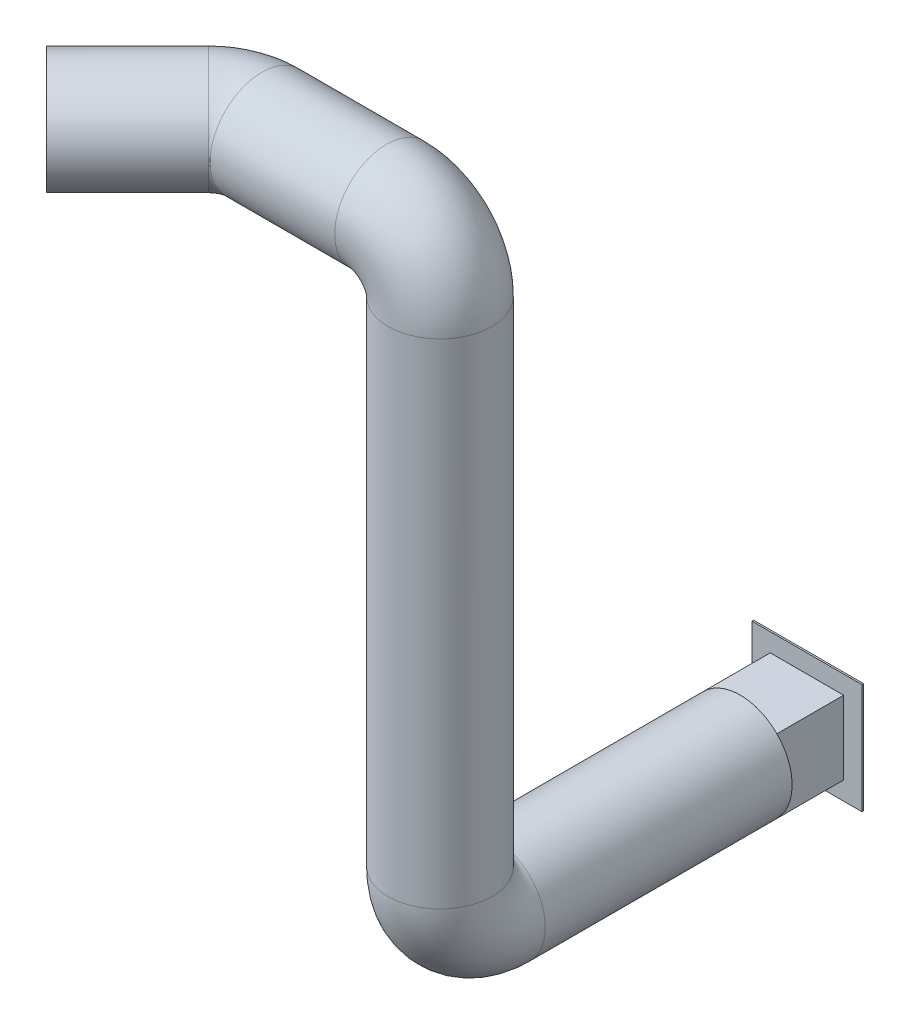
ISO-10303-21;
HEADER;
FILE_DESCRIPTION(('STEP AP214'),'2;1');
FILE_NAME('part.step','',(''),(''),'','','');
FILE_SCHEMA(('AUTOMOTIVE_DESIGN { 1 0 10303 214 1 1 1 1 }'));
ENDSEC;
DATA;
#1=APPLICATION_CONTEXT('core data for automotive mechanical design processes');
#2=APPLICATION_PROTOCOL_DEFINITION('international standard','automotive_design',2000,#1);
#3=PRODUCT_CONTEXT('',#1,'mechanical');
#4=PRODUCT('Part','Part','',(#3));
#5=PRODUCT_RELATED_PRODUCT_CATEGORY('part','',(#4));
#6=PRODUCT_DEFINITION_FORMATION('','',#4);
#7=PRODUCT_DEFINITION_CONTEXT('part definition',#1,'design');
#8=PRODUCT_DEFINITION('design','',#6,#7);
#9=PRODUCT_DEFINITION_SHAPE('','',#8);
#10=(LENGTH_UNIT() NAMED_UNIT(*) SI_UNIT(.MILLI.,.METRE.));
#11=(NAMED_UNIT(*) PLANE_ANGLE_UNIT() SI_UNIT($,.RADIAN.));
#12=(NAMED_UNIT(*) SI_UNIT($,.STERADIAN.) SOLID_ANGLE_UNIT());
#13=UNCERTAINTY_MEASURE_WITH_UNIT(LENGTH_MEASURE(1.E-05),#10,'distance_accuracy_value','');
#14=(GEOMETRIC_REPRESENTATION_CONTEXT(3) GLOBAL_UNCERTAINTY_ASSIGNED_CONTEXT((#13)) GLOBAL_UNIT_ASSIGNED_CONTEXT((#10,
#11,#12)) REPRESENTATION_CONTEXT('',''));
#15=CARTESIAN_POINT('',(0.,0.,0.));
#16=DIRECTION('',(0.,0.,1.));
#17=DIRECTION('',(1.,0.,0.));
#18=AXIS2_PLACEMENT_3D('',#15,#16,#17);
#19=CARTESIAN_POINT('',(0.,0.,2.5));
#20=DIRECTION('',(0.,0.,1.));
#21=DIRECTION('',(1.,0.,0.));
#22=AXIS2_PLACEMENT_3D('',#19,#20,#21);
#23=PLANE('',#22);
#24=DIRECTION('',(0.,-1.,0.));
#25=VECTOR('',#24,1.);
#26=CARTESIAN_POINT('',(0.,0.,2.5));
#27=LINE('',#26,#25);
#28=CARTESIAN_POINT('',(0.,0.,2.5));
#29=VERTEX_POINT('',#28);
#30=CARTESIAN_POINT('',(0.,-165.,2.5));
#31=VERTEX_POINT('',#30);
#32=EDGE_CURVE('E204',#29,#31,#27,.T.);
#33=ORIENTED_EDGE('',*,*,#32,.T.);
#34=DIRECTION('',(1.,0.,0.));
#35=VECTOR('',#34,1.);
#36=CARTESIAN_POINT('',(0.,-165.,2.5));
#37=LINE('',#36,#35);
#38=CARTESIAN_POINT('',(165.,-165.,2.5));
#39=VERTEX_POINT('',#38);
#40=EDGE_CURVE('E207',#31,#39,#37,.T.);
#41=ORIENTED_EDGE('',*,*,#40,.T.);
#42=DIRECTION('',(0.,1.,0.));
#43=VECTOR('',#42,1.);
#44=CARTESIAN_POINT('',(165.,0.,2.5));
#45=LINE('',#44,#43);
#46=CARTESIAN_POINT('',(165.,0.,2.5));
#47=VERTEX_POINT('',#46);
#48=EDGE_CURVE('E210',#39,#47,#45,.T.);
#49=ORIENTED_EDGE('',*,*,#48,.T.);
#50=DIRECTION('',(-1.,0.,0.));
#51=VECTOR('',#50,1.);
#52=CARTESIAN_POINT('',(0.,0.,2.5));
#53=LINE('',#52,#51);
#54=EDGE_CURVE('E212',#47,#29,#53,.T.);
#55=ORIENTED_EDGE('',*,*,#54,.T.);
#56=EDGE_LOOP('',(#33,#41,#49,#55));
#57=FACE_BOUND('',#56,.T.);
#58=DIRECTION('',(0.,-1.,0.));
#59=VECTOR('',#58,1.);
#60=CARTESIAN_POINT('',(27.5,-27.5,2.5));
#61=LINE('',#60,#59);
#62=CARTESIAN_POINT('',(27.5,-27.5,2.5));
#63=VERTEX_POINT('',#62);
#64=CARTESIAN_POINT('',(27.5,-137.5,2.5));
#65=VERTEX_POINT('',#64);
#66=EDGE_CURVE('E172',#63,#65,#61,.T.);
#67=ORIENTED_EDGE('',*,*,#66,.F.);
#68=DIRECTION('',(-1.,0.,0.));
#69=VECTOR('',#68,1.);
#70=CARTESIAN_POINT('',(27.5,-27.5,2.5));
#71=LINE('',#70,#69);
#72=CARTESIAN_POINT('',(137.5,-27.5,2.5));
#73=VERTEX_POINT('',#72);
#74=EDGE_CURVE('E155',#73,#63,#71,.T.);
#75=ORIENTED_EDGE('',*,*,#74,.F.);
#76=DIRECTION('',(0.,1.,0.));
#77=VECTOR('',#76,1.);
#78=CARTESIAN_POINT('',(137.5,-27.5,2.5));
#79=LINE('',#78,#77);
#80=CARTESIAN_POINT('',(137.5,-137.5,2.5));
#81=VERTEX_POINT('',#80);
#82=EDGE_CURVE('E160',#81,#73,#79,.T.);
#83=ORIENTED_EDGE('',*,*,#82,.F.);
#84=DIRECTION('',(1.,0.,0.));
#85=VECTOR('',#84,1.);
#86=CARTESIAN_POINT('',(27.5,-137.5,2.5));
#87=LINE('',#86,#85);
#88=EDGE_CURVE('E174',#65,#81,#87,.T.);
#89=ORIENTED_EDGE('',*,*,#88,.F.);
#90=EDGE_LOOP('',(#67,#75,#83,#89));
#91=FACE_BOUND('',#90,.T.);
#92=ADVANCED_FACE('F33',(#57,#91),#23,.T.);
#93=CARTESIAN_POINT('',(0.,0.,0.));
#94=DIRECTION('',(0.,0.,1.));
#95=DIRECTION('',(1.,0.,0.));
#96=AXIS2_PLACEMENT_3D('',#93,#94,#95);
#97=PLANE('',#96);
#98=DIRECTION('',(0.,-1.,0.));
#99=VECTOR('',#98,1.);
#100=CARTESIAN_POINT('',(0.,0.,0.));
#101=LINE('',#100,#99);
#102=CARTESIAN_POINT('',(0.,0.,0.));
#103=VERTEX_POINT('',#102);
#104=CARTESIAN_POINT('',(0.,-165.,0.));
#105=VERTEX_POINT('',#104);
#106=EDGE_CURVE('E203',#103,#105,#101,.T.);
#107=ORIENTED_EDGE('',*,*,#106,.F.);
#108=DIRECTION('',(-1.,0.,0.));
#109=VECTOR('',#108,1.);
#110=CARTESIAN_POINT('',(0.,0.,0.));
#111=LINE('',#110,#109);
#112=CARTESIAN_POINT('',(165.,0.,0.));
#113=VERTEX_POINT('',#112);
#114=EDGE_CURVE('E208',#113,#103,#111,.T.);
#115=ORIENTED_EDGE('',*,*,#114,.F.);
#116=DIRECTION('',(0.,1.,0.));
#117=VECTOR('',#116,1.);
#118=CARTESIAN_POINT('',(165.,0.,0.));
#119=LINE('',#118,#117);
#120=CARTESIAN_POINT('',(165.,-165.,0.));
#121=VERTEX_POINT('',#120);
#122=EDGE_CURVE('E219',#121,#113,#119,.T.);
#123=ORIENTED_EDGE('',*,*,#122,.F.);
#124=DIRECTION('',(1.,0.,0.));
#125=VECTOR('',#124,1.);
#126=CARTESIAN_POINT('',(0.,-165.,0.));
#127=LINE('',#126,#125);
#128=EDGE_CURVE('E217',#105,#121,#127,.T.);
#129=ORIENTED_EDGE('',*,*,#128,.F.);
#130=EDGE_LOOP('',(#107,#115,#123,#129));
#131=FACE_BOUND('',#130,.T.);
#132=DIRECTION('',(0.,1.,0.));
#133=VECTOR('',#132,1.);
#134=CARTESIAN_POINT('',(135.,-135.,0.));
#135=LINE('',#134,#133);
#136=CARTESIAN_POINT('',(135.,-135.,0.));
#137=VERTEX_POINT('',#136);
#138=CARTESIAN_POINT('',(135.,-30.,0.));
#139=VERTEX_POINT('',#138);
#140=EDGE_CURVE('E56',#137,#139,#135,.T.);
#141=ORIENTED_EDGE('',*,*,#140,.T.);
#142=DIRECTION('',(-1.,0.,0.));
#143=VECTOR('',#142,1.);
#144=CARTESIAN_POINT('',(30.,-30.,0.));
#145=LINE('',#144,#143);
#146=CARTESIAN_POINT('',(30.,-30.,0.));
#147=VERTEX_POINT('',#146);
#148=EDGE_CURVE('E186',#139,#147,#145,.T.);
#149=ORIENTED_EDGE('',*,*,#148,.T.);
#150=DIRECTION('',(0.,-1.,0.));
#151=VECTOR('',#150,1.);
#152=CARTESIAN_POINT('',(30.,-135.,0.));
#153=LINE('',#152,#151);
#154=CARTESIAN_POINT('',(30.,-135.,0.));
#155=VERTEX_POINT('',#154);
#156=EDGE_CURVE('E189',#147,#155,#153,.T.);
#157=ORIENTED_EDGE('',*,*,#156,.T.);
#158=DIRECTION('',(1.,0.,0.));
#159=VECTOR('',#158,1.);
#160=CARTESIAN_POINT('',(30.,-135.,0.));
#161=LINE('',#160,#159);
#162=EDGE_CURVE('E192',#155,#137,#161,.T.);
#163=ORIENTED_EDGE('',*,*,#162,.T.);
#164=EDGE_LOOP('',(#141,#149,#157,#163));
#165=FACE_BOUND('',#164,.T.);
#166=ADVANCED_FACE('F237',(#131,#165),#97,.F.);
#167=CARTESIAN_POINT('',(0.,0.,2.5));
#168=DIRECTION('',(1.,0.,0.));
#169=DIRECTION('',(0.,1.,0.));
#170=AXIS2_PLACEMENT_3D('',#167,#168,#169);
#171=PLANE('',#170);
#172=ORIENTED_EDGE('',*,*,#106,.T.);
#173=DIRECTION('',(0.,0.,-1.));
#174=VECTOR('',#173,1.);
#175=CARTESIAN_POINT('',(0.,-165.,2.5));
#176=LINE('',#175,#174);
#177=EDGE_CURVE('E11',#31,#105,#176,.T.);
#178=ORIENTED_EDGE('',*,*,#177,.F.);
#179=ORIENTED_EDGE('',*,*,#32,.F.);
#180=DIRECTION('',(0.,0.,-1.));
#181=VECTOR('',#180,1.);
#182=CARTESIAN_POINT('',(0.,0.,2.5));
#183=LINE('',#182,#181);
#184=EDGE_CURVE('E214',#29,#103,#183,.T.);
#185=ORIENTED_EDGE('',*,*,#184,.T.);
#186=EDGE_LOOP('',(#172,#178,#179,#185));
#187=FACE_BOUND('',#186,.T.);
#188=ADVANCED_FACE('F35',(#187),#171,.F.);
#189=CARTESIAN_POINT('',(0.,-165.,2.5));
#190=DIRECTION('',(0.,1.,0.));
#191=DIRECTION('',(0.,0.,1.));
#192=AXIS2_PLACEMENT_3D('',#189,#190,#191);
#193=PLANE('',#192);
#194=ORIENTED_EDGE('',*,*,#128,.T.);
#195=DIRECTION('',(0.,0.,-1.));
#196=VECTOR('',#195,1.);
#197=CARTESIAN_POINT('',(165.,-165.,2.5));
#198=LINE('',#197,#196);
#199=EDGE_CURVE('E41',#39,#121,#198,.T.);
#200=ORIENTED_EDGE('',*,*,#199,.F.);
#201=ORIENTED_EDGE('',*,*,#40,.F.);
#202=ORIENTED_EDGE('',*,*,#177,.T.);
#203=EDGE_LOOP('',(#194,#200,#201,#202));
#204=FACE_BOUND('',#203,.T.);
#205=ADVANCED_FACE('F248',(#204),#193,.F.);
#206=CARTESIAN_POINT('',(165.,0.,2.5));
#207=DIRECTION('',(-1.,0.,0.));
#208=DIRECTION('',(0.,-1.,0.));
#209=AXIS2_PLACEMENT_3D('',#206,#207,#208);
#210=PLANE('',#209);
#211=ORIENTED_EDGE('',*,*,#122,.T.);
#212=DIRECTION('',(0.,0.,-1.));
#213=VECTOR('',#212,1.);
#214=CARTESIAN_POINT('',(165.,0.,2.5));
#215=LINE('',#214,#213);
#216=EDGE_CURVE('E224',#47,#113,#215,.T.);
#217=ORIENTED_EDGE('',*,*,#216,.F.);
#218=ORIENTED_EDGE('',*,*,#48,.F.);
#219=ORIENTED_EDGE('',*,*,#199,.T.);
#220=EDGE_LOOP('',(#211,#217,#218,#219));
#221=FACE_BOUND('',#220,.T.);
#222=ADVANCED_FACE('F231',(#221),#210,.F.);
#223=CARTESIAN_POINT('',(0.,0.,2.5));
#224=DIRECTION('',(0.,-1.,0.));
#225=DIRECTION('',(0.,0.,-1.));
#226=AXIS2_PLACEMENT_3D('',#223,#224,#225);
#227=PLANE('',#226);
#228=ORIENTED_EDGE('',*,*,#114,.T.);
#229=ORIENTED_EDGE('',*,*,#184,.F.);
#230=ORIENTED_EDGE('',*,*,#54,.F.);
#231=ORIENTED_EDGE('',*,*,#216,.T.);
#232=EDGE_LOOP('',(#228,#229,#230,#231));
#233=FACE_BOUND('',#232,.T.);
#234=ADVANCED_FACE('F241',(#233),#227,.F.);
#235=CARTESIAN_POINT('',(135.,-135.,2.5));
#236=DIRECTION('',(-1.,0.,0.));
#237=DIRECTION('',(0.,0.,1.));
#238=AXIS2_PLACEMENT_3D('',#235,#236,#237);
#239=PLANE('',#238);
#240=ORIENTED_EDGE('',*,*,#140,.F.);
#241=DIRECTION('',(0.,0.,-1.));
#242=VECTOR('',#241,1.);
#243=CARTESIAN_POINT('',(135.,-135.,2.5));
#244=LINE('',#243,#242);
#245=CARTESIAN_POINT('',(135.,-135.,102.5));
#246=VERTEX_POINT('',#245);
#247=EDGE_CURVE('E195',#246,#137,#244,.T.);
#248=ORIENTED_EDGE('',*,*,#247,.F.);
#249=DIRECTION('',(0.,1.,0.));
#250=VECTOR('',#249,1.);
#251=CARTESIAN_POINT('',(135.,-30.,102.5));
#252=LINE('',#251,#250);
#253=CARTESIAN_POINT('',(135.,-30.,102.5));
#254=VERTEX_POINT('',#253);
#255=EDGE_CURVE('E149',#246,#254,#252,.T.);
#256=ORIENTED_EDGE('',*,*,#255,.T.);
#257=DIRECTION('',(0.,0.,-1.));
#258=VECTOR('',#257,1.);
#259=CARTESIAN_POINT('',(135.,-30.,2.5));
#260=LINE('',#259,#258);
#261=EDGE_CURVE('E201',#254,#139,#260,.T.);
#262=ORIENTED_EDGE('',*,*,#261,.T.);
#263=EDGE_LOOP('',(#240,#248,#256,#262));
#264=FACE_BOUND('',#263,.T.);
#265=ADVANCED_FACE('F262',(#264),#239,.T.);
#266=CARTESIAN_POINT('',(30.,-30.,2.5));
#267=DIRECTION('',(0.,-1.,0.));
#268=DIRECTION('',(0.,0.,-1.));
#269=AXIS2_PLACEMENT_3D('',#266,#267,#268);
#270=PLANE('',#269);
#271=ORIENTED_EDGE('',*,*,#148,.F.);
#272=ORIENTED_EDGE('',*,*,#261,.F.);
#273=DIRECTION('',(-1.,0.,0.));
#274=VECTOR('',#273,1.);
#275=CARTESIAN_POINT('',(30.,-30.,102.5));
#276=LINE('',#275,#274);
#277=CARTESIAN_POINT('',(30.,-30.,102.5));
#278=VERTEX_POINT('',#277);
#279=EDGE_CURVE('E152',#254,#278,#276,.T.);
#280=ORIENTED_EDGE('',*,*,#279,.T.);
#281=DIRECTION('',(0.,0.,-1.));
#282=VECTOR('',#281,1.);
#283=CARTESIAN_POINT('',(30.,-30.,2.5));
#284=LINE('',#283,#282);
#285=EDGE_CURVE('E199',#278,#147,#284,.T.);
#286=ORIENTED_EDGE('',*,*,#285,.T.);
#287=EDGE_LOOP('',(#271,#272,#280,#286));
#288=FACE_BOUND('',#287,.T.);
#289=ADVANCED_FACE('F269',(#288),#270,.T.);
#290=CARTESIAN_POINT('',(30.,-135.,2.5));
#291=DIRECTION('',(1.,0.,0.));
#292=DIRECTION('',(0.,0.,-1.));
#293=AXIS2_PLACEMENT_3D('',#290,#291,#292);
#294=PLANE('',#293);
#295=ORIENTED_EDGE('',*,*,#156,.F.);
#296=ORIENTED_EDGE('',*,*,#285,.F.);
#297=DIRECTION('',(0.,-1.,0.));
#298=VECTOR('',#297,1.);
#299=CARTESIAN_POINT('',(30.,-30.,102.5));
#300=LINE('',#299,#298);
#301=CARTESIAN_POINT('',(30.,-135.,102.5));
#302=VERTEX_POINT('',#301);
#303=EDGE_CURVE('E142',#278,#302,#300,.T.);
#304=ORIENTED_EDGE('',*,*,#303,.T.);
#305=DIRECTION('',(0.,0.,-1.));
#306=VECTOR('',#305,1.);
#307=CARTESIAN_POINT('',(30.,-135.,2.5));
#308=LINE('',#307,#306);
#309=EDGE_CURVE('E197',#302,#155,#308,.T.);
#310=ORIENTED_EDGE('',*,*,#309,.T.);
#311=EDGE_LOOP('',(#295,#296,#304,#310));
#312=FACE_BOUND('',#311,.T.);
#313=ADVANCED_FACE('F273',(#312),#294,.T.);
#314=CARTESIAN_POINT('',(30.,-135.,2.5));
#315=DIRECTION('',(0.,1.,0.));
#316=DIRECTION('',(0.,0.,1.));
#317=AXIS2_PLACEMENT_3D('',#314,#315,#316);
#318=PLANE('',#317);
#319=ORIENTED_EDGE('',*,*,#162,.F.);
#320=ORIENTED_EDGE('',*,*,#309,.F.);
#321=DIRECTION('',(1.,0.,0.));
#322=VECTOR('',#321,1.);
#323=CARTESIAN_POINT('',(30.,-135.,102.5));
#324=LINE('',#323,#322);
#325=EDGE_CURVE('E146',#302,#246,#324,.T.);
#326=ORIENTED_EDGE('',*,*,#325,.T.);
#327=ORIENTED_EDGE('',*,*,#247,.T.);
#328=EDGE_LOOP('',(#319,#320,#326,#327));
#329=FACE_BOUND('',#328,.T.);
#330=ADVANCED_FACE('F278',(#329),#318,.T.);
#331=CARTESIAN_POINT('',(27.5,-27.5,102.5));
#332=DIRECTION('',(0.,-1.,0.));
#333=DIRECTION('',(0.,0.,-1.));
#334=AXIS2_PLACEMENT_3D('',#331,#332,#333);
#335=PLANE('',#334);
#336=ORIENTED_EDGE('',*,*,#74,.T.);
#337=DIRECTION('',(0.,0.,-1.));
#338=VECTOR('',#337,1.);
#339=CARTESIAN_POINT('',(27.5,-27.5,102.5));
#340=LINE('',#339,#338);
#341=CARTESIAN_POINT('',(27.5,-27.5,102.5));
#342=VERTEX_POINT('',#341);
#343=EDGE_CURVE('E183',#342,#63,#340,.T.);
#344=ORIENTED_EDGE('',*,*,#343,.F.);
#345=DIRECTION('',(-1.,0.,0.));
#346=VECTOR('',#345,1.);
#347=CARTESIAN_POINT('',(27.5,-27.5,102.5));
#348=LINE('',#347,#346);
#349=CARTESIAN_POINT('',(137.5,-27.5,102.5));
#350=VERTEX_POINT('',#349);
#351=EDGE_CURVE('E156',#350,#342,#348,.T.);
#352=ORIENTED_EDGE('',*,*,#351,.F.);
#353=DIRECTION('',(0.,0.,-1.));
#354=VECTOR('',#353,1.);
#355=CARTESIAN_POINT('',(137.5,-27.5,102.5));
#356=LINE('',#355,#354);
#357=EDGE_CURVE('E169',#350,#73,#356,.T.);
#358=ORIENTED_EDGE('',*,*,#357,.T.);
#359=EDGE_LOOP('',(#336,#344,#352,#358));
#360=FACE_BOUND('',#359,.T.);
#361=ADVANCED_FACE('F284',(#360),#335,.F.);
#362=CARTESIAN_POINT('',(27.5,-27.5,102.5));
#363=DIRECTION('',(1.,0.,0.));
#364=DIRECTION('',(0.,0.,-1.));
#365=AXIS2_PLACEMENT_3D('',#362,#363,#364);
#366=PLANE('',#365);
#367=ORIENTED_EDGE('',*,*,#66,.T.);
#368=DIRECTION('',(0.,0.,-1.));
#369=VECTOR('',#368,1.);
#370=CARTESIAN_POINT('',(27.5,-137.5,102.5));
#371=LINE('',#370,#369);
#372=CARTESIAN_POINT('',(27.5,-137.5,102.5));
#373=VERTEX_POINT('',#372);
#374=EDGE_CURVE('E180',#373,#65,#371,.T.);
#375=ORIENTED_EDGE('',*,*,#374,.F.);
#376=DIRECTION('',(0.,-1.,0.));
#377=VECTOR('',#376,1.);
#378=CARTESIAN_POINT('',(27.5,-27.5,102.5));
#379=LINE('',#378,#377);
#380=EDGE_CURVE('E159',#342,#373,#379,.T.);
#381=ORIENTED_EDGE('',*,*,#380,.F.);
#382=ORIENTED_EDGE('',*,*,#343,.T.);
#383=EDGE_LOOP('',(#367,#375,#381,#382));
#384=FACE_BOUND('',#383,.T.);
#385=ADVANCED_FACE('F288',(#384),#366,.F.);
#386=CARTESIAN_POINT('',(27.5,-137.5,102.5));
#387=DIRECTION('',(0.,1.,0.));
#388=DIRECTION('',(0.,0.,1.));
#389=AXIS2_PLACEMENT_3D('',#386,#387,#388);
#390=PLANE('',#389);
#391=ORIENTED_EDGE('',*,*,#88,.T.);
#392=DIRECTION('',(0.,0.,-1.));
#393=VECTOR('',#392,1.);
#394=CARTESIAN_POINT('',(137.5,-137.5,102.5));
#395=LINE('',#394,#393);
#396=CARTESIAN_POINT('',(137.5,-137.5,102.5));
#397=VERTEX_POINT('',#396);
#398=EDGE_CURVE('E48',#397,#81,#395,.T.);
#399=ORIENTED_EDGE('',*,*,#398,.F.);
#400=DIRECTION('',(1.,0.,0.));
#401=VECTOR('',#400,1.);
#402=CARTESIAN_POINT('',(27.5,-137.5,102.5));
#403=LINE('',#402,#401);
#404=EDGE_CURVE('E163',#373,#397,#403,.T.);
#405=ORIENTED_EDGE('',*,*,#404,.F.);
#406=ORIENTED_EDGE('',*,*,#374,.T.);
#407=EDGE_LOOP('',(#391,#399,#405,#406));
#408=FACE_BOUND('',#407,.T.);
#409=ADVANCED_FACE('F292',(#408),#390,.F.);
#410=CARTESIAN_POINT('',(137.5,-27.5,102.5));
#411=DIRECTION('',(-1.,0.,0.));
#412=DIRECTION('',(0.,0.,1.));
#413=AXIS2_PLACEMENT_3D('',#410,#411,#412);
#414=PLANE('',#413);
#415=ORIENTED_EDGE('',*,*,#82,.T.);
#416=ORIENTED_EDGE('',*,*,#357,.F.);
#417=DIRECTION('',(0.,1.,0.));
#418=VECTOR('',#417,1.);
#419=CARTESIAN_POINT('',(137.5,-27.5,102.5));
#420=LINE('',#419,#418);
#421=EDGE_CURVE('E166',#397,#350,#420,.T.);
#422=ORIENTED_EDGE('',*,*,#421,.F.);
#423=ORIENTED_EDGE('',*,*,#398,.T.);
#424=EDGE_LOOP('',(#415,#416,#422,#423));
#425=FACE_BOUND('',#424,.T.);
#426=ADVANCED_FACE('F296',(#425),#414,.F.);
#427=CARTESIAN_POINT('',(82.5,-82.5,102.5));
#428=DIRECTION('',(0.,0.,1.));
#429=DIRECTION('',(1.,0.,0.));
#430=AXIS2_PLACEMENT_3D('',#427,#428,#429);
#431=PLANE('',#430);
#432=ORIENTED_EDGE('',*,*,#303,.F.);
#433=ORIENTED_EDGE('',*,*,#279,.F.);
#434=ORIENTED_EDGE('',*,*,#255,.F.);
#435=ORIENTED_EDGE('',*,*,#325,.F.);
#436=EDGE_LOOP('',(#432,#433,#434,#435));
#437=FACE_BOUND('',#436,.T.);
#438=ADVANCED_FACE('F300',(#437),#431,.F.);
#439=CARTESIAN_POINT('',(82.5,-82.5,102.5));
#440=DIRECTION('',(0.,0.,1.));
#441=DIRECTION('',(1.,0.,0.));
#442=AXIS2_PLACEMENT_3D('',#439,#440,#441);
#443=CIRCLE('',#442,77.7817459305202);
#444=EDGE_CURVE('E135',#350,#342,#443,.T.);
#445=ORIENTED_EDGE('',*,*,#444,.F.);
#446=ORIENTED_EDGE('',*,*,#351,.T.);
#447=EDGE_LOOP('',(#445,#446));
#448=FACE_BOUND('',#447,.T.);
#449=ADVANCED_FACE('F310',(#448),#431,.F.);
#450=EDGE_CURVE('E143',#342,#373,#443,.T.);
#451=ORIENTED_EDGE('',*,*,#450,.F.);
#452=ORIENTED_EDGE('',*,*,#380,.T.);
#453=EDGE_LOOP('',(#451,#452));
#454=FACE_BOUND('',#453,.T.);
#455=ADVANCED_FACE('F420',(#454),#431,.F.);
#456=EDGE_CURVE('E133',#373,#397,#443,.T.);
#457=ORIENTED_EDGE('',*,*,#456,.F.);
#458=ORIENTED_EDGE('',*,*,#404,.T.);
#459=EDGE_LOOP('',(#457,#458));
#460=FACE_BOUND('',#459,.T.);
#461=ADVANCED_FACE('F305',(#460),#431,.F.);
#462=CARTESIAN_POINT('',(82.5,-82.5,202.5));
#463=DIRECTION('',(0.,0.,-1.));
#464=DIRECTION('',(-1.,0.,0.));
#465=AXIS2_PLACEMENT_3D('',#462,#463,#464);
#466=CYLINDRICAL_SURFACE('',#465,77.7817459305202);
#467=ORIENTED_EDGE('',*,*,#444,.T.);
#468=ORIENTED_EDGE('',*,*,#450,.T.);
#469=ORIENTED_EDGE('',*,*,#456,.T.);
#470=EDGE_CURVE('E129',#397,#350,#443,.T.);
#471=ORIENTED_EDGE('',*,*,#470,.T.);
#472=EDGE_LOOP('',(#467,#468,#469,#471));
#473=FACE_BOUND('',#472,.T.);
#474=CARTESIAN_POINT('',(82.5,-82.5,472.5));
#475=DIRECTION('',(0.,0.,1.));
#476=DIRECTION('',(1.,0.,0.));
#477=AXIS2_PLACEMENT_3D('',#474,#475,#476);
#478=CIRCLE('',#477,77.7817459305202);
#479=CARTESIAN_POINT('',(82.5,-160.28174593052,472.5));
#480=VERTEX_POINT('',#479);
#481=EDGE_CURVE('E343',#480,#480,#478,.T.);
#482=ORIENTED_EDGE('',*,*,#481,.F.);
#483=EDGE_LOOP('',(#482));
#484=FACE_BOUND('',#483,.T.);
#485=ADVANCED_FACE('F301',(#473,#484),#466,.T.);
#486=ORIENTED_EDGE('',*,*,#470,.F.);
#487=ORIENTED_EDGE('',*,*,#421,.T.);
#488=EDGE_LOOP('',(#486,#487));
#489=FACE_BOUND('',#488,.T.);
#490=ADVANCED_FACE('F304',(#489),#431,.F.);
#491=CARTESIAN_POINT('',(-362.5,817.5,697.5));
#492=DIRECTION('',(-0.707106781186548,0.,0.707106781186547));
#493=DIRECTION('',(0.,1.,0.));
#494=AXIS2_PLACEMENT_3D('',#491,#492,#493);
#495=PLANE('',#494);
#496=CARTESIAN_POINT('',(-362.5,817.5,697.5));
#497=DIRECTION('',(-0.707106781186548,0.,0.707106781186547));
#498=DIRECTION('',(0.,1.,0.));
#499=AXIS2_PLACEMENT_3D('',#496,#497,#498);
#500=CIRCLE('',#499,77.7817459305202);
#501=CARTESIAN_POINT('',(-362.5,895.28174593052,697.5));
#502=VERTEX_POINT('',#501);
#503=EDGE_CURVE('E126',#502,#502,#500,.T.);
#504=ORIENTED_EDGE('',*,*,#503,.T.);
#505=EDGE_LOOP('',(#504));
#506=FACE_BOUND('',#505,.T.);
#507=ADVANCED_FACE('F127',(#506),#495,.T.);
#508=CARTESIAN_POINT('',(82.5,-2.5,472.5));
#509=DIRECTION('',(-1.,0.,0.));
#510=DIRECTION('',(0.,0.,1.));
#511=AXIS2_PLACEMENT_3D('',#508,#509,#510);
#512=TOROIDAL_SURFACE('',#511,80.,77.7817459305202);
#513=CARTESIAN_POINT('',(82.5,-2.5,552.5));
#514=DIRECTION('',(0.,1.,0.));
#515=DIRECTION('',(1.,0.,0.));
#516=AXIS2_PLACEMENT_3D('',#513,#514,#515);
#517=CIRCLE('',#516,77.7817459305202);
#518=CARTESIAN_POINT('',(82.5,-2.5,630.28174593052));
#519=VERTEX_POINT('',#518);
#520=EDGE_CURVE('E340',#519,#519,#517,.T.);
#521=CARTESIAN_POINT('',(82.5,-2.5,472.5));
#522=DIRECTION('',(-1.,0.,0.));
#523=DIRECTION('',(0.,0.,1.));
#524=AXIS2_PLACEMENT_3D('',#521,#522,#523);
#525=CIRCLE('',#524,157.78174593052);
#526=EDGE_CURVE('',#480,#519,#525,.T.);
#527=ORIENTED_EDGE('',*,*,#481,.T.);
#528=ORIENTED_EDGE('',*,*,#520,.F.);
#529=ORIENTED_EDGE('',*,*,#526,.T.);
#530=ORIENTED_EDGE('',*,*,#526,.F.);
#531=EDGE_LOOP('',(#527,#529,#528,#530));
#532=FACE_BOUND('',#531,.T.);
#533=ADVANCED_FACE('F314',(#532),#512,.T.);
#534=CARTESIAN_POINT('',(82.5,-2.5,552.5));
#535=DIRECTION('',(0.,1.,0.));
#536=DIRECTION('',(0.,0.,1.));
#537=AXIS2_PLACEMENT_3D('',#534,#535,#536);
#538=CYLINDRICAL_SURFACE('',#537,77.7817459305202);
#539=CARTESIAN_POINT('',(82.5,737.5,552.5));
#540=DIRECTION('',(0.,1.,0.));
#541=DIRECTION('',(1.,0.,0.));
#542=AXIS2_PLACEMENT_3D('',#539,#540,#541);
#543=CIRCLE('',#542,77.7817459305202);
#544=CARTESIAN_POINT('',(160.28174593052,737.5,552.5));
#545=VERTEX_POINT('',#544);
#546=EDGE_CURVE('E346',#545,#545,#543,.T.);
#547=ORIENTED_EDGE('',*,*,#546,.F.);
#548=EDGE_LOOP('',(#547));
#549=FACE_BOUND('',#548,.T.);
#550=ORIENTED_EDGE('',*,*,#520,.T.);
#551=EDGE_LOOP('',(#550));
#552=FACE_BOUND('',#551,.T.);
#553=ADVANCED_FACE('F328',(#549,#552),#538,.T.);
#554=CARTESIAN_POINT('',(2.49999999999999,737.5,552.5));
#555=DIRECTION('',(0.,0.,1.));
#556=DIRECTION('',(1.,0.,0.));
#557=AXIS2_PLACEMENT_3D('',#554,#555,#556);
#558=TOROIDAL_SURFACE('',#557,80.,77.7817459305202);
#559=CARTESIAN_POINT('',(2.49999999999989,817.5,552.5));
#560=DIRECTION('',(-1.,0.,0.));
#561=DIRECTION('',(0.,1.,0.));
#562=AXIS2_PLACEMENT_3D('',#559,#560,#561);
#563=CIRCLE('',#562,77.7817459305202);
#564=CARTESIAN_POINT('',(2.4999999999998,895.28174593052,552.5));
#565=VERTEX_POINT('',#564);
#566=EDGE_CURVE('E351',#565,#565,#563,.T.);
#567=CARTESIAN_POINT('',(2.49999999999999,737.5,552.5));
#568=DIRECTION('',(0.,0.,1.));
#569=DIRECTION('',(1.,0.,0.));
#570=AXIS2_PLACEMENT_3D('',#567,#568,#569);
#571=CIRCLE('',#570,157.78174593052);
#572=EDGE_CURVE('',#545,#565,#571,.T.);
#573=ORIENTED_EDGE('',*,*,#546,.T.);
#574=ORIENTED_EDGE('',*,*,#566,.F.);
#575=ORIENTED_EDGE('',*,*,#572,.T.);
#576=ORIENTED_EDGE('',*,*,#572,.F.);
#577=EDGE_LOOP('',(#573,#575,#574,#576));
#578=FACE_BOUND('',#577,.T.);
#579=ADVANCED_FACE('F324',(#578),#558,.T.);
#580=CARTESIAN_POINT('',(2.49999999999989,817.5,552.5));
#581=DIRECTION('',(-1.,0.,0.));
#582=DIRECTION('',(0.,-1.,0.));
#583=AXIS2_PLACEMENT_3D('',#580,#581,#582);
#584=CYLINDRICAL_SURFACE('',#583,77.7817459305202);
#585=CARTESIAN_POINT('',(-184.362915010152,817.5,552.5));
#586=DIRECTION('',(-1.,0.,0.));
#587=DIRECTION('',(0.,1.,0.));
#588=AXIS2_PLACEMENT_3D('',#585,#586,#587);
#589=CIRCLE('',#588,77.7817459305202);
#590=CARTESIAN_POINT('',(-184.362915010152,817.499999999999,474.71825406948));
#591=VERTEX_POINT('',#590);
#592=EDGE_CURVE('E137',#591,#591,#589,.T.);
#593=ORIENTED_EDGE('',*,*,#592,.F.);
#594=EDGE_LOOP('',(#593));
#595=FACE_BOUND('',#594,.T.);
#596=ORIENTED_EDGE('',*,*,#566,.T.);
#597=EDGE_LOOP('',(#596));
#598=FACE_BOUND('',#597,.T.);
#599=ADVANCED_FACE('F320',(#595,#598),#584,.T.);
#600=CARTESIAN_POINT('',(-184.362915010152,817.5,632.5));
#601=DIRECTION('',(0.,1.,0.));
#602=DIRECTION('',(0.,0.,1.));
#603=AXIS2_PLACEMENT_3D('',#600,#601,#602);
#604=TOROIDAL_SURFACE('',#603,80.,77.7817459305202);
#605=CARTESIAN_POINT('',(-240.931457505076,817.5,575.931457505076));
#606=DIRECTION('',(-0.707106781186548,0.,0.707106781186547));
#607=DIRECTION('',(0.,1.,0.));
#608=AXIS2_PLACEMENT_3D('',#605,#606,#607);
#609=CIRCLE('',#608,77.7817459305202);
#610=CARTESIAN_POINT('',(-295.931457505076,817.5,520.931457505076));
#611=VERTEX_POINT('',#610);
#612=EDGE_CURVE('E130',#611,#611,#609,.T.);
#613=CARTESIAN_POINT('',(-184.362915010152,817.5,632.5));
#614=DIRECTION('',(0.,1.,0.));
#615=DIRECTION('',(0.,0.,1.));
#616=AXIS2_PLACEMENT_3D('',#613,#614,#615);
#617=CIRCLE('',#616,157.78174593052);
#618=EDGE_CURVE('',#591,#611,#617,.T.);
#619=ORIENTED_EDGE('',*,*,#592,.T.);
#620=ORIENTED_EDGE('',*,*,#612,.F.);
#621=ORIENTED_EDGE('',*,*,#618,.T.);
#622=ORIENTED_EDGE('',*,*,#618,.F.);
#623=EDGE_LOOP('',(#619,#621,#620,#622));
#624=FACE_BOUND('',#623,.T.);
#625=ADVANCED_FACE('F317',(#624),#604,.T.);
#626=CARTESIAN_POINT('',(-240.931457505076,817.499999999999,575.931457505076));
#627=DIRECTION('',(-0.707106781186548,0.,0.707106781186547));
#628=DIRECTION('',(0.707106781186547,0.,0.707106781186548));
#629=AXIS2_PLACEMENT_3D('',#626,#627,#628);
#630=CYLINDRICAL_SURFACE('',#629,77.7817459305202);
#631=ORIENTED_EDGE('',*,*,#503,.F.);
#632=EDGE_LOOP('',(#631));
#633=FACE_BOUND('',#632,.T.);
#634=ORIENTED_EDGE('',*,*,#612,.T.);
#635=EDGE_LOOP('',(#634));
#636=FACE_BOUND('',#635,.T.);
#637=ADVANCED_FACE('F311',(#633,#636),#630,.T.);
#638=CLOSED_SHELL('',(#92,#166,#188,#205,#222,#234,#265,#289,#313,#330,#361,#385,#409,#426,#438,
#449,#455,#461,#485,#490,#507,#533,#553,#579,#599,#625,#637));
#639=MANIFOLD_SOLID_BREP('B2',#638);
#640=ADVANCED_BREP_SHAPE_REPRESENTATION('',(#18,#639),#14);
#641=SHAPE_DEFINITION_REPRESENTATION(#9,#640);
ENDSEC;
END-ISO-10303-21;
